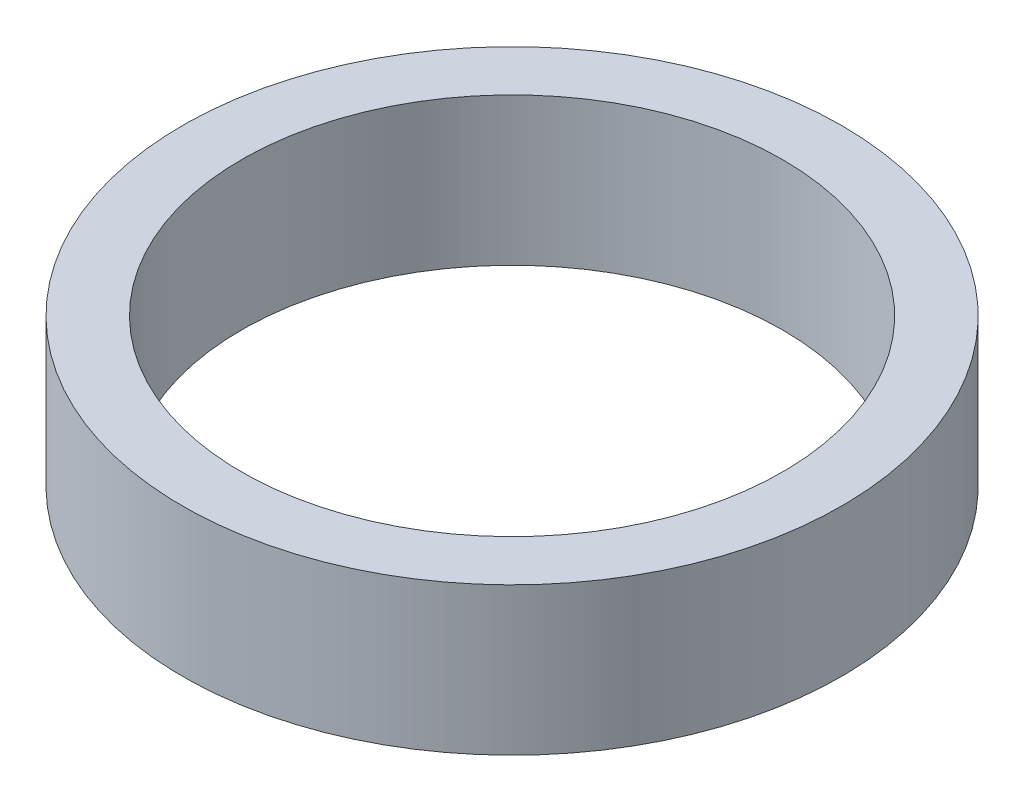
ISO-10303-21;
HEADER;
FILE_DESCRIPTION(('STEP AP214'),'2;1');
FILE_NAME('part.step','',(''),(''),'','','');
FILE_SCHEMA(('AUTOMOTIVE_DESIGN { 1 0 10303 214 1 1 1 1 }'));
ENDSEC;
DATA;
#1=APPLICATION_CONTEXT('core data for automotive mechanical design processes');
#2=APPLICATION_PROTOCOL_DEFINITION('international standard','automotive_design',2000,#1);
#3=PRODUCT_CONTEXT('',#1,'mechanical');
#4=PRODUCT('Part','Part','',(#3));
#5=PRODUCT_RELATED_PRODUCT_CATEGORY('part','',(#4));
#6=PRODUCT_DEFINITION_FORMATION('','',#4);
#7=PRODUCT_DEFINITION_CONTEXT('part definition',#1,'design');
#8=PRODUCT_DEFINITION('design','',#6,#7);
#9=PRODUCT_DEFINITION_SHAPE('','',#8);
#10=(LENGTH_UNIT() NAMED_UNIT(*) SI_UNIT(.MILLI.,.METRE.));
#11=(NAMED_UNIT(*) PLANE_ANGLE_UNIT() SI_UNIT($,.RADIAN.));
#12=(NAMED_UNIT(*) SI_UNIT($,.STERADIAN.) SOLID_ANGLE_UNIT());
#13=UNCERTAINTY_MEASURE_WITH_UNIT(LENGTH_MEASURE(1.E-05),#10,'distance_accuracy_value','');
#14=(GEOMETRIC_REPRESENTATION_CONTEXT(3) GLOBAL_UNCERTAINTY_ASSIGNED_CONTEXT((#13)) GLOBAL_UNIT_ASSIGNED_CONTEXT((#10,
#11,#12)) REPRESENTATION_CONTEXT('',''));
#15=CARTESIAN_POINT('',(0.,0.,0.));
#16=DIRECTION('',(0.,0.,1.));
#17=DIRECTION('',(1.,0.,0.));
#18=AXIS2_PLACEMENT_3D('',#15,#16,#17);
#19=CARTESIAN_POINT('',(0.,1.5,0.));
#20=DIRECTION('',(0.,1.,0.));
#21=DIRECTION('',(0.,0.,-1.));
#22=AXIS2_PLACEMENT_3D('',#19,#20,#21);
#23=PLANE('',#22);
#24=CARTESIAN_POINT('',(0.,1.5,0.));
#25=DIRECTION('',(0.,-1.,0.));
#26=DIRECTION('',(0.,0.,-1.));
#27=AXIS2_PLACEMENT_3D('',#24,#25,#26);
#28=CIRCLE('',#27,3.35);
#29=CARTESIAN_POINT('',(0.,1.5,-3.35));
#30=VERTEX_POINT('',#29);
#31=EDGE_CURVE('E10',#30,#30,#28,.T.);
#32=ORIENTED_EDGE('',*,*,#31,.F.);
#33=EDGE_LOOP('',(#32));
#34=FACE_BOUND('',#33,.T.);
#35=CARTESIAN_POINT('',(0.,1.5,0.));
#36=DIRECTION('',(0.,-1.,0.));
#37=DIRECTION('',(0.,0.,-1.));
#38=AXIS2_PLACEMENT_3D('',#35,#36,#37);
#39=CIRCLE('',#38,2.75);
#40=CARTESIAN_POINT('',(0.,1.5,-2.75));
#41=VERTEX_POINT('',#40);
#42=EDGE_CURVE('E46',#41,#41,#39,.T.);
#43=ORIENTED_EDGE('',*,*,#42,.T.);
#44=EDGE_LOOP('',(#43));
#45=FACE_BOUND('',#44,.T.);
#46=ADVANCED_FACE('F35',(#34,#45),#23,.T.);
#47=CARTESIAN_POINT('',(0.,0.,0.));
#48=DIRECTION('',(0.,1.,0.));
#49=DIRECTION('',(0.,0.,-1.));
#50=AXIS2_PLACEMENT_3D('',#47,#48,#49);
#51=PLANE('',#50);
#52=CARTESIAN_POINT('',(0.,0.,0.));
#53=DIRECTION('',(0.,-1.,0.));
#54=DIRECTION('',(0.,0.,-1.));
#55=AXIS2_PLACEMENT_3D('',#52,#53,#54);
#56=CIRCLE('',#55,3.35);
#57=CARTESIAN_POINT('',(0.,0.,-3.35));
#58=VERTEX_POINT('',#57);
#59=EDGE_CURVE('E39',#58,#58,#56,.T.);
#60=ORIENTED_EDGE('',*,*,#59,.T.);
#61=EDGE_LOOP('',(#60));
#62=FACE_BOUND('',#61,.T.);
#63=CARTESIAN_POINT('',(0.,0.,0.));
#64=DIRECTION('',(0.,-1.,0.));
#65=DIRECTION('',(0.,0.,-1.));
#66=AXIS2_PLACEMENT_3D('',#63,#64,#65);
#67=CIRCLE('',#66,2.75);
#68=CARTESIAN_POINT('',(0.,0.,-2.75));
#69=VERTEX_POINT('',#68);
#70=EDGE_CURVE('E48',#69,#69,#67,.T.);
#71=ORIENTED_EDGE('',*,*,#70,.F.);
#72=EDGE_LOOP('',(#71));
#73=FACE_BOUND('',#72,.T.);
#74=ADVANCED_FACE('F61',(#62,#73),#51,.F.);
#75=CARTESIAN_POINT('',(0.,1.5,0.));
#76=DIRECTION('',(0.,-1.,0.));
#77=DIRECTION('',(0.,0.,1.));
#78=AXIS2_PLACEMENT_3D('',#75,#76,#77);
#79=CYLINDRICAL_SURFACE('',#78,3.35);
#80=ORIENTED_EDGE('',*,*,#31,.T.);
#81=EDGE_LOOP('',(#80));
#82=FACE_BOUND('',#81,.T.);
#83=ORIENTED_EDGE('',*,*,#59,.F.);
#84=EDGE_LOOP('',(#83));
#85=FACE_BOUND('',#84,.T.);
#86=ADVANCED_FACE('F37',(#82,#85),#79,.T.);
#87=CARTESIAN_POINT('',(0.,1.5,0.));
#88=DIRECTION('',(0.,-1.,0.));
#89=DIRECTION('',(0.,0.,1.));
#90=AXIS2_PLACEMENT_3D('',#87,#88,#89);
#91=CYLINDRICAL_SURFACE('',#90,2.75);
#92=ORIENTED_EDGE('',*,*,#42,.F.);
#93=EDGE_LOOP('',(#92));
#94=FACE_BOUND('',#93,.T.);
#95=ORIENTED_EDGE('',*,*,#70,.T.);
#96=EDGE_LOOP('',(#95));
#97=FACE_BOUND('',#96,.T.);
#98=ADVANCED_FACE('F55',(#94,#97),#91,.F.);
#99=CLOSED_SHELL('',(#46,#74,#86,#98));
#100=MANIFOLD_SOLID_BREP('B2',#99);
#101=ADVANCED_BREP_SHAPE_REPRESENTATION('',(#18,#100),#14);
#102=SHAPE_DEFINITION_REPRESENTATION(#9,#101);
ENDSEC;
END-ISO-10303-21;
